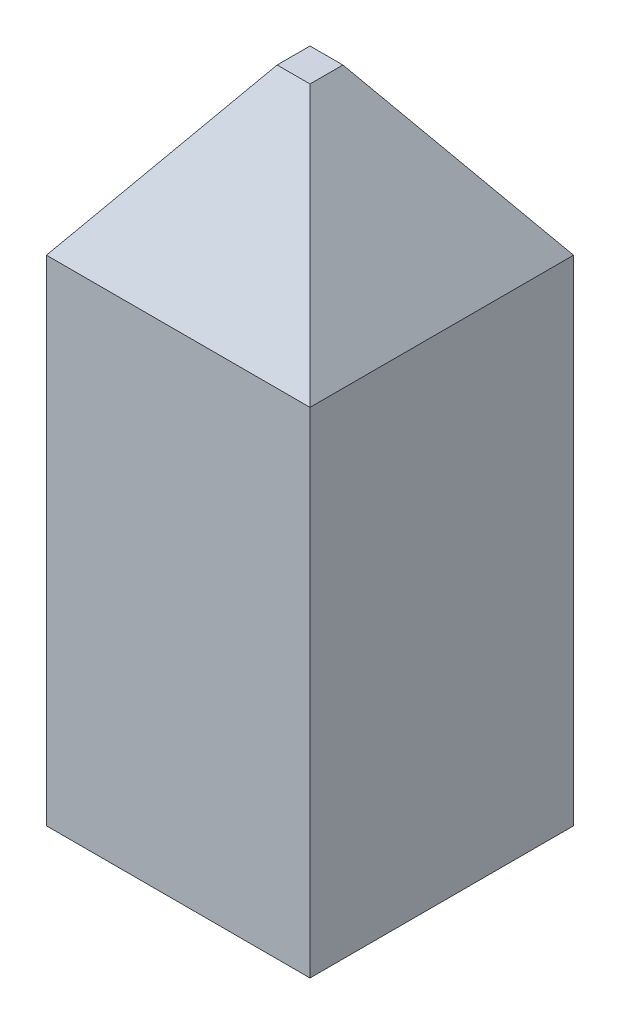
ISO-10303-21;
HEADER;
FILE_DESCRIPTION(('STEP AP214'),'2;1');
FILE_NAME('part.step','',(''),(''),'','','');
FILE_SCHEMA(('AUTOMOTIVE_DESIGN { 1 0 10303 214 1 1 1 1 }'));
ENDSEC;
DATA;
#1=APPLICATION_CONTEXT('core data for automotive mechanical design processes');
#2=APPLICATION_PROTOCOL_DEFINITION('international standard','automotive_design',2000,#1);
#3=PRODUCT_CONTEXT('',#1,'mechanical');
#4=PRODUCT('Part','Part','',(#3));
#5=PRODUCT_RELATED_PRODUCT_CATEGORY('part','',(#4));
#6=PRODUCT_DEFINITION_FORMATION('','',#4);
#7=PRODUCT_DEFINITION_CONTEXT('part definition',#1,'design');
#8=PRODUCT_DEFINITION('design','',#6,#7);
#9=PRODUCT_DEFINITION_SHAPE('','',#8);
#10=(LENGTH_UNIT() NAMED_UNIT(*) SI_UNIT(.MILLI.,.METRE.));
#11=(NAMED_UNIT(*) PLANE_ANGLE_UNIT() SI_UNIT($,.RADIAN.));
#12=(NAMED_UNIT(*) SI_UNIT($,.STERADIAN.) SOLID_ANGLE_UNIT());
#13=UNCERTAINTY_MEASURE_WITH_UNIT(LENGTH_MEASURE(1.E-05),#10,'distance_accuracy_value','');
#14=(GEOMETRIC_REPRESENTATION_CONTEXT(3) GLOBAL_UNCERTAINTY_ASSIGNED_CONTEXT((#13)) GLOBAL_UNIT_ASSIGNED_CONTEXT((#10,
#11,#12)) REPRESENTATION_CONTEXT('',''));
#15=CARTESIAN_POINT('',(0.,0.,0.));
#16=DIRECTION('',(0.,0.,1.));
#17=DIRECTION('',(1.,0.,0.));
#18=AXIS2_PLACEMENT_3D('',#15,#16,#17);
#19=CARTESIAN_POINT('',(0.2,0.75,0.2));
#20=DIRECTION('',(-1.,0.,0.));
#21=DIRECTION('',(0.,0.,1.));
#22=AXIS2_PLACEMENT_3D('',#19,#20,#21);
#23=PLANE('',#22);
#24=DIRECTION('',(0.,0.,-1.));
#25=VECTOR('',#24,1.);
#26=CARTESIAN_POINT('',(0.2,0.,0.2));
#27=LINE('',#26,#25);
#28=CARTESIAN_POINT('',(0.2,0.,0.2));
#29=VERTEX_POINT('',#28);
#30=CARTESIAN_POINT('',(0.2,0.,-0.2));
#31=VERTEX_POINT('',#30);
#32=EDGE_CURVE('E114',#29,#31,#27,.T.);
#33=ORIENTED_EDGE('',*,*,#32,.T.);
#34=DIRECTION('',(0.,-1.,0.));
#35=VECTOR('',#34,1.);
#36=CARTESIAN_POINT('',(0.2,0.75,-0.2));
#37=LINE('',#36,#35);
#38=CARTESIAN_POINT('',(0.2,0.75,-0.2));
#39=VERTEX_POINT('',#38);
#40=EDGE_CURVE('E11',#39,#31,#37,.T.);
#41=ORIENTED_EDGE('',*,*,#40,.F.);
#42=DIRECTION('',(0.,0.,-1.));
#43=VECTOR('',#42,1.);
#44=CARTESIAN_POINT('',(0.2,0.75,0.2));
#45=LINE('',#44,#43);
#46=CARTESIAN_POINT('',(0.2,0.75,0.2));
#47=VERTEX_POINT('',#46);
#48=EDGE_CURVE('E93',#47,#39,#45,.T.);
#49=ORIENTED_EDGE('',*,*,#48,.F.);
#50=DIRECTION('',(0.,-1.,0.));
#51=VECTOR('',#50,1.);
#52=CARTESIAN_POINT('',(0.2,0.75,0.2));
#53=LINE('',#52,#51);
#54=EDGE_CURVE('E95',#47,#29,#53,.T.);
#55=ORIENTED_EDGE('',*,*,#54,.T.);
#56=EDGE_LOOP('',(#33,#41,#49,#55));
#57=FACE_BOUND('',#56,.T.);
#58=ADVANCED_FACE('F33',(#57),#23,.F.);
#59=CARTESIAN_POINT('',(-0.2,0.75,-0.2));
#60=DIRECTION('',(0.,0.,1.));
#61=DIRECTION('',(1.,0.,0.));
#62=AXIS2_PLACEMENT_3D('',#59,#60,#61);
#63=PLANE('',#62);
#64=DIRECTION('',(-1.,0.,0.));
#65=VECTOR('',#64,1.);
#66=CARTESIAN_POINT('',(-0.2,0.,-0.2));
#67=LINE('',#66,#65);
#68=CARTESIAN_POINT('',(-0.2,0.,-0.2));
#69=VERTEX_POINT('',#68);
#70=EDGE_CURVE('E127',#31,#69,#67,.T.);
#71=ORIENTED_EDGE('',*,*,#70,.T.);
#72=DIRECTION('',(0.,-1.,0.));
#73=VECTOR('',#72,1.);
#74=CARTESIAN_POINT('',(-0.2,0.75,-0.2));
#75=LINE('',#74,#73);
#76=CARTESIAN_POINT('',(-0.2,0.75,-0.2));
#77=VERTEX_POINT('',#76);
#78=EDGE_CURVE('E41',#77,#69,#75,.T.);
#79=ORIENTED_EDGE('',*,*,#78,.F.);
#80=DIRECTION('',(-1.,0.,0.));
#81=VECTOR('',#80,1.);
#82=CARTESIAN_POINT('',(-0.2,0.75,-0.2));
#83=LINE('',#82,#81);
#84=EDGE_CURVE('E75',#39,#77,#83,.T.);
#85=ORIENTED_EDGE('',*,*,#84,.F.);
#86=ORIENTED_EDGE('',*,*,#40,.T.);
#87=EDGE_LOOP('',(#71,#79,#85,#86));
#88=FACE_BOUND('',#87,.T.);
#89=ADVANCED_FACE('F134',(#88),#63,.F.);
#90=CARTESIAN_POINT('',(-0.2,0.75,0.2));
#91=DIRECTION('',(1.,0.,0.));
#92=DIRECTION('',(0.,0.,-1.));
#93=AXIS2_PLACEMENT_3D('',#90,#91,#92);
#94=PLANE('',#93);
#95=DIRECTION('',(0.,0.,1.));
#96=VECTOR('',#95,1.);
#97=CARTESIAN_POINT('',(-0.2,0.,0.2));
#98=LINE('',#97,#96);
#99=CARTESIAN_POINT('',(-0.2,0.,0.2));
#100=VERTEX_POINT('',#99);
#101=EDGE_CURVE('E65',#69,#100,#98,.T.);
#102=ORIENTED_EDGE('',*,*,#101,.T.);
#103=DIRECTION('',(0.,-1.,0.));
#104=VECTOR('',#103,1.);
#105=CARTESIAN_POINT('',(-0.2,0.75,0.2));
#106=LINE('',#105,#104);
#107=CARTESIAN_POINT('',(-0.2,0.75,0.2));
#108=VERTEX_POINT('',#107);
#109=EDGE_CURVE('E49',#108,#100,#106,.T.);
#110=ORIENTED_EDGE('',*,*,#109,.F.);
#111=DIRECTION('',(0.,0.,1.));
#112=VECTOR('',#111,1.);
#113=CARTESIAN_POINT('',(-0.2,0.75,0.2));
#114=LINE('',#113,#112);
#115=EDGE_CURVE('E121',#77,#108,#114,.T.);
#116=ORIENTED_EDGE('',*,*,#115,.F.);
#117=ORIENTED_EDGE('',*,*,#78,.T.);
#118=EDGE_LOOP('',(#102,#110,#116,#117));
#119=FACE_BOUND('',#118,.T.);
#120=ADVANCED_FACE('F131',(#119),#94,.F.);
#121=CARTESIAN_POINT('',(-0.2,0.75,0.2));
#122=DIRECTION('',(0.,0.,-1.));
#123=DIRECTION('',(-1.,0.,0.));
#124=AXIS2_PLACEMENT_3D('',#121,#122,#123);
#125=PLANE('',#124);
#126=DIRECTION('',(1.,0.,0.));
#127=VECTOR('',#126,1.);
#128=CARTESIAN_POINT('',(-0.2,0.,0.2));
#129=LINE('',#128,#127);
#130=EDGE_CURVE('E70',#100,#29,#129,.T.);
#131=ORIENTED_EDGE('',*,*,#130,.T.);
#132=ORIENTED_EDGE('',*,*,#54,.F.);
#133=DIRECTION('',(1.,0.,0.));
#134=VECTOR('',#133,1.);
#135=CARTESIAN_POINT('',(-0.2,0.75,0.2));
#136=LINE('',#135,#134);
#137=EDGE_CURVE('E104',#108,#47,#136,.T.);
#138=ORIENTED_EDGE('',*,*,#137,.F.);
#139=ORIENTED_EDGE('',*,*,#109,.T.);
#140=EDGE_LOOP('',(#131,#132,#138,#139));
#141=FACE_BOUND('',#140,.T.);
#142=ADVANCED_FACE('F102',(#141),#125,.F.);
#143=CARTESIAN_POINT('',(0.,0.,0.));
#144=DIRECTION('',(0.,-1.,0.));
#145=DIRECTION('',(0.,0.,-1.));
#146=AXIS2_PLACEMENT_3D('',#143,#144,#145);
#147=PLANE('',#146);
#148=ORIENTED_EDGE('',*,*,#32,.F.);
#149=ORIENTED_EDGE('',*,*,#130,.F.);
#150=ORIENTED_EDGE('',*,*,#101,.F.);
#151=ORIENTED_EDGE('',*,*,#70,.F.);
#152=EDGE_LOOP('',(#148,#149,#150,#151));
#153=FACE_BOUND('',#152,.T.);
#154=ADVANCED_FACE('F133',(#153),#147,.T.);
#155=CARTESIAN_POINT('',(-0.2,0.75,0.2));
#156=DIRECTION('',(0.,0.573576436351046,0.819152044288991));
#157=DIRECTION('',(0.,-0.819152044288991,0.573576436351046));
#158=AXIS2_PLACEMENT_3D('',#155,#156,#157);
#159=PLANE('',#158);
#160=ORIENTED_EDGE('',*,*,#137,.T.);
#161=DIRECTION('',(0.497542812164523,-0.710564775461629,0.497542812164523));
#162=VECTOR('',#161,1.);
#163=CARTESIAN_POINT('',(0.2,0.75,0.2));
#164=LINE('',#163,#162);
#165=CARTESIAN_POINT('',(0.0249481154475723,1.,0.0249481154475724));
#166=VERTEX_POINT('',#165);
#167=EDGE_CURVE('E108',#166,#47,#164,.T.);
#168=ORIENTED_EDGE('',*,*,#167,.F.);
#169=DIRECTION('',(-1.,0.,0.));
#170=VECTOR('',#169,1.);
#171=CARTESIAN_POINT('',(-0.2,1.,0.0249481154475724));
#172=LINE('',#171,#170);
#173=CARTESIAN_POINT('',(-0.0249481154475725,1.,0.0249481154475724));
#174=VERTEX_POINT('',#173);
#175=EDGE_CURVE('E163',#174,#166,#172,.F.);
#176=ORIENTED_EDGE('',*,*,#175,.F.);
#177=DIRECTION('',(-0.497542812164523,-0.710564775461629,0.497542812164523));
#178=VECTOR('',#177,1.);
#179=CARTESIAN_POINT('',(-0.2,0.75,0.2));
#180=LINE('',#179,#178);
#181=EDGE_CURVE('E120',#174,#108,#180,.T.);
#182=ORIENTED_EDGE('',*,*,#181,.T.);
#183=EDGE_LOOP('',(#160,#168,#176,#182));
#184=FACE_BOUND('',#183,.T.);
#185=ADVANCED_FACE('F118',(#184),#159,.T.);
#186=CARTESIAN_POINT('',(0.2,0.75,0.2));
#187=DIRECTION('',(0.819152044288991,0.573576436351046,0.));
#188=DIRECTION('',(-0.573576436351046,0.819152044288991,0.));
#189=AXIS2_PLACEMENT_3D('',#186,#187,#188);
#190=PLANE('',#189);
#191=ORIENTED_EDGE('',*,*,#48,.T.);
#192=DIRECTION('',(0.497542812164523,-0.710564775461629,-0.497542812164523));
#193=VECTOR('',#192,1.);
#194=CARTESIAN_POINT('',(0.2,0.75,-0.2));
#195=LINE('',#194,#193);
#196=CARTESIAN_POINT('',(0.0249481154475723,1.,-0.0249481154475723));
#197=VERTEX_POINT('',#196);
#198=EDGE_CURVE('E115',#197,#39,#195,.T.);
#199=ORIENTED_EDGE('',*,*,#198,.F.);
#200=DIRECTION('',(0.,0.,1.));
#201=VECTOR('',#200,1.);
#202=CARTESIAN_POINT('',(0.0249481154475723,1.,0.2));
#203=LINE('',#202,#201);
#204=EDGE_CURVE('E110',#166,#197,#203,.F.);
#205=ORIENTED_EDGE('',*,*,#204,.F.);
#206=ORIENTED_EDGE('',*,*,#167,.T.);
#207=EDGE_LOOP('',(#191,#199,#205,#206));
#208=FACE_BOUND('',#207,.T.);
#209=ADVANCED_FACE('F109',(#208),#190,.T.);
#210=CARTESIAN_POINT('',(0.2,0.75,-0.2));
#211=DIRECTION('',(0.,0.573576436351046,-0.819152044288991));
#212=DIRECTION('',(0.,0.819152044288991,0.573576436351046));
#213=AXIS2_PLACEMENT_3D('',#210,#211,#212);
#214=PLANE('',#213);
#215=ORIENTED_EDGE('',*,*,#84,.T.);
#216=DIRECTION('',(-0.497542812164523,-0.710564775461629,-0.497542812164523));
#217=VECTOR('',#216,1.);
#218=CARTESIAN_POINT('',(-0.2,0.75,-0.2));
#219=LINE('',#218,#217);
#220=CARTESIAN_POINT('',(-0.0249481154475725,1.,-0.0249481154475723));
#221=VERTEX_POINT('',#220);
#222=EDGE_CURVE('E176',#221,#77,#219,.T.);
#223=ORIENTED_EDGE('',*,*,#222,.F.);
#224=DIRECTION('',(1.,0.,0.));
#225=VECTOR('',#224,1.);
#226=CARTESIAN_POINT('',(0.2,1.,-0.0249481154475723));
#227=LINE('',#226,#225);
#228=EDGE_CURVE('E167',#197,#221,#227,.F.);
#229=ORIENTED_EDGE('',*,*,#228,.F.);
#230=ORIENTED_EDGE('',*,*,#198,.T.);
#231=EDGE_LOOP('',(#215,#223,#229,#230));
#232=FACE_BOUND('',#231,.T.);
#233=ADVANCED_FACE('F148',(#232),#214,.T.);
#234=CARTESIAN_POINT('',(-0.2,0.75,-0.2));
#235=DIRECTION('',(-0.819152044288991,0.573576436351046,0.));
#236=DIRECTION('',(-0.573576436351046,-0.819152044288991,0.));
#237=AXIS2_PLACEMENT_3D('',#234,#235,#236);
#238=PLANE('',#237);
#239=ORIENTED_EDGE('',*,*,#115,.T.);
#240=ORIENTED_EDGE('',*,*,#181,.F.);
#241=DIRECTION('',(0.,0.,-1.));
#242=VECTOR('',#241,1.);
#243=CARTESIAN_POINT('',(-0.0249481154475724,1.,-0.2));
#244=LINE('',#243,#242);
#245=EDGE_CURVE('E165',#221,#174,#244,.F.);
#246=ORIENTED_EDGE('',*,*,#245,.F.);
#247=ORIENTED_EDGE('',*,*,#222,.T.);
#248=EDGE_LOOP('',(#239,#240,#246,#247));
#249=FACE_BOUND('',#248,.T.);
#250=ADVANCED_FACE('F151',(#249),#238,.T.);
#251=CARTESIAN_POINT('',(0.,1.,0.));
#252=DIRECTION('',(0.,1.,0.));
#253=DIRECTION('',(0.,0.,1.));
#254=AXIS2_PLACEMENT_3D('',#251,#252,#253);
#255=PLANE('',#254);
#256=ORIENTED_EDGE('',*,*,#175,.T.);
#257=ORIENTED_EDGE('',*,*,#204,.T.);
#258=ORIENTED_EDGE('',*,*,#228,.T.);
#259=ORIENTED_EDGE('',*,*,#245,.T.);
#260=EDGE_LOOP('',(#256,#257,#258,#259));
#261=FACE_BOUND('',#260,.T.);
#262=ADVANCED_FACE('F155',(#261),#255,.T.);
#263=CLOSED_SHELL('',(#58,#89,#120,#142,#154,#185,#209,#233,#250,#262));
#264=MANIFOLD_SOLID_BREP('B2',#263);
#265=ADVANCED_BREP_SHAPE_REPRESENTATION('',(#18,#264),#14);
#266=SHAPE_DEFINITION_REPRESENTATION(#9,#265);
ENDSEC;
END-ISO-10303-21;
